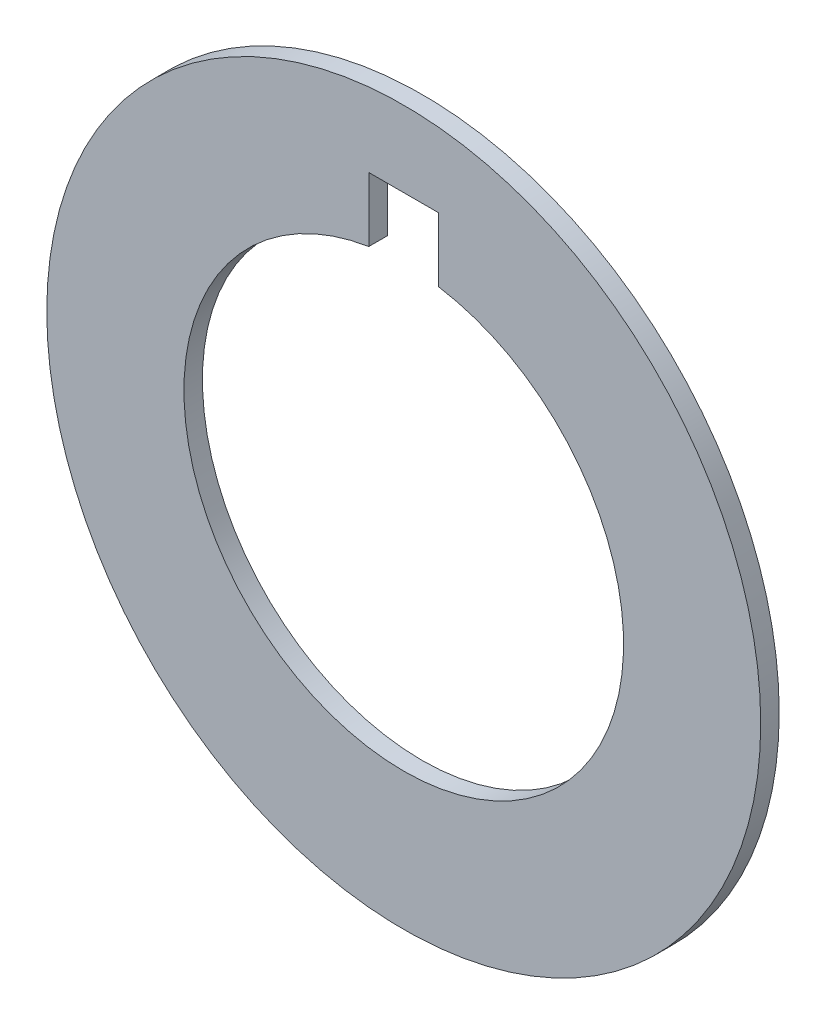
ISO-10303-21;
HEADER;
FILE_DESCRIPTION(('STEP AP214'),'2;1');
FILE_NAME('part.step','',(''),(''),'','','');
FILE_SCHEMA(('AUTOMOTIVE_DESIGN { 1 0 10303 214 1 1 1 1 }'));
ENDSEC;
DATA;
#1=APPLICATION_CONTEXT('core data for automotive mechanical design processes');
#2=APPLICATION_PROTOCOL_DEFINITION('international standard','automotive_design',2000,#1);
#3=PRODUCT_CONTEXT('',#1,'mechanical');
#4=PRODUCT('Part','Part','',(#3));
#5=PRODUCT_RELATED_PRODUCT_CATEGORY('part','',(#4));
#6=PRODUCT_DEFINITION_FORMATION('','',#4);
#7=PRODUCT_DEFINITION_CONTEXT('part definition',#1,'design');
#8=PRODUCT_DEFINITION('design','',#6,#7);
#9=PRODUCT_DEFINITION_SHAPE('','',#8);
#10=(LENGTH_UNIT() NAMED_UNIT(*) SI_UNIT(.MILLI.,.METRE.));
#11=(NAMED_UNIT(*) PLANE_ANGLE_UNIT() SI_UNIT($,.RADIAN.));
#12=(NAMED_UNIT(*) SI_UNIT($,.STERADIAN.) SOLID_ANGLE_UNIT());
#13=UNCERTAINTY_MEASURE_WITH_UNIT(LENGTH_MEASURE(1.E-05),#10,'distance_accuracy_value','');
#14=(GEOMETRIC_REPRESENTATION_CONTEXT(3) GLOBAL_UNCERTAINTY_ASSIGNED_CONTEXT((#13)) GLOBAL_UNIT_ASSIGNED_CONTEXT((#10,
#11,#12)) REPRESENTATION_CONTEXT('',''));
#15=CARTESIAN_POINT('',(0.,0.,0.));
#16=DIRECTION('',(0.,0.,1.));
#17=DIRECTION('',(1.,0.,0.));
#18=AXIS2_PLACEMENT_3D('',#15,#16,#17);
#19=CARTESIAN_POINT('',(0.,0.,0.9398));
#20=DIRECTION('',(0.,0.,1.));
#21=DIRECTION('',(1.,0.,0.));
#22=AXIS2_PLACEMENT_3D('',#19,#20,#21);
#23=PLANE('',#22);
#24=CARTESIAN_POINT('',(0.,0.,0.9398));
#25=DIRECTION('',(0.,0.,1.));
#26=DIRECTION('',(1.,0.,0.));
#27=AXIS2_PLACEMENT_3D('',#24,#25,#26);
#28=CIRCLE('',#27,11.176);
#29=CARTESIAN_POINT('',(1.778,11.0336617675185,0.9398));
#30=VERTEX_POINT('',#29);
#31=CARTESIAN_POINT('',(-1.778,11.0336617675185,0.9398));
#32=VERTEX_POINT('',#31);
#33=EDGE_CURVE('E44',#30,#32,#28,.F.);
#34=ORIENTED_EDGE('',*,*,#33,.T.);
#35=DIRECTION('',(0.,1.,0.));
#36=VECTOR('',#35,1.);
#37=CARTESIAN_POINT('',(-1.778,11.0336617675185,0.9398));
#38=LINE('',#37,#36);
#39=CARTESIAN_POINT('',(-1.778,14.2944088179873,0.9398));
#40=VERTEX_POINT('',#39);
#41=EDGE_CURVE('E90',#40,#32,#38,.F.);
#42=ORIENTED_EDGE('',*,*,#41,.F.);
#43=DIRECTION('',(1.,0.,0.));
#44=VECTOR('',#43,1.);
#45=CARTESIAN_POINT('',(-1.778,14.2944088179873,0.9398));
#46=LINE('',#45,#44);
#47=CARTESIAN_POINT('',(1.778,14.2944088179873,0.9398));
#48=VERTEX_POINT('',#47);
#49=EDGE_CURVE('E57',#48,#40,#46,.F.);
#50=ORIENTED_EDGE('',*,*,#49,.F.);
#51=DIRECTION('',(0.,1.,0.));
#52=VECTOR('',#51,1.);
#53=CARTESIAN_POINT('',(1.778,14.2944088179873,0.9398));
#54=LINE('',#53,#52);
#55=EDGE_CURVE('E78',#30,#48,#54,.T.);
#56=ORIENTED_EDGE('',*,*,#55,.F.);
#57=EDGE_LOOP('',(#34,#42,#50,#56));
#58=FACE_BOUND('',#57,.T.);
#59=CARTESIAN_POINT('',(0.,0.,0.9398));
#60=DIRECTION('',(0.,0.,1.));
#61=DIRECTION('',(1.,0.,0.));
#62=AXIS2_PLACEMENT_3D('',#59,#60,#61);
#63=CIRCLE('',#62,18.1483);
#64=CARTESIAN_POINT('',(18.1483,0.,0.9398));
#65=VERTEX_POINT('',#64);
#66=EDGE_CURVE('E19',#65,#65,#63,.F.);
#67=ORIENTED_EDGE('',*,*,#66,.F.);
#68=EDGE_LOOP('',(#67));
#69=FACE_BOUND('',#68,.T.);
#70=ADVANCED_FACE('F16',(#58,#69),#23,.T.);
#71=CARTESIAN_POINT('',(0.,0.,0.));
#72=DIRECTION('',(0.,0.,1.));
#73=DIRECTION('',(1.,0.,0.));
#74=AXIS2_PLACEMENT_3D('',#71,#72,#73);
#75=CYLINDRICAL_SURFACE('',#74,18.1483);
#76=ORIENTED_EDGE('',*,*,#66,.T.);
#77=EDGE_LOOP('',(#76));
#78=FACE_BOUND('',#77,.T.);
#79=CARTESIAN_POINT('',(0.,0.,0.));
#80=DIRECTION('',(0.,0.,1.));
#81=DIRECTION('',(1.,0.,0.));
#82=AXIS2_PLACEMENT_3D('',#79,#80,#81);
#83=CIRCLE('',#82,18.1483);
#84=CARTESIAN_POINT('',(18.1483,0.,0.));
#85=VERTEX_POINT('',#84);
#86=EDGE_CURVE('E73',#85,#85,#83,.F.);
#87=ORIENTED_EDGE('',*,*,#86,.F.);
#88=EDGE_LOOP('',(#87));
#89=FACE_BOUND('',#88,.T.);
#90=ADVANCED_FACE('F114',(#78,#89),#75,.T.);
#91=CARTESIAN_POINT('',(-1.778,14.2944088179873,0.));
#92=DIRECTION('',(0.,-1.,0.));
#93=DIRECTION('',(0.,0.,-1.));
#94=AXIS2_PLACEMENT_3D('',#91,#92,#93);
#95=PLANE('',#94);
#96=ORIENTED_EDGE('',*,*,#49,.T.);
#97=DIRECTION('',(0.,0.,-1.));
#98=VECTOR('',#97,1.);
#99=CARTESIAN_POINT('',(-1.778,14.2944088179873,0.));
#100=LINE('',#99,#98);
#101=CARTESIAN_POINT('',(-1.778,14.2944088179873,0.));
#102=VERTEX_POINT('',#101);
#103=EDGE_CURVE('E68',#102,#40,#100,.F.);
#104=ORIENTED_EDGE('',*,*,#103,.F.);
#105=DIRECTION('',(-1.,0.,0.));
#106=VECTOR('',#105,1.);
#107=CARTESIAN_POINT('',(0.,14.2944088179873,0.));
#108=LINE('',#107,#106);
#109=CARTESIAN_POINT('',(1.778,14.2944088179873,0.));
#110=VERTEX_POINT('',#109);
#111=EDGE_CURVE('E62',#110,#102,#108,.T.);
#112=ORIENTED_EDGE('',*,*,#111,.F.);
#113=DIRECTION('',(0.,0.,1.));
#114=VECTOR('',#113,1.);
#115=CARTESIAN_POINT('',(1.778,14.2944088179873,0.));
#116=LINE('',#115,#114);
#117=EDGE_CURVE('E65',#48,#110,#116,.F.);
#118=ORIENTED_EDGE('',*,*,#117,.F.);
#119=EDGE_LOOP('',(#96,#104,#112,#118));
#120=FACE_BOUND('',#119,.T.);
#121=ADVANCED_FACE('F64',(#120),#95,.T.);
#122=CARTESIAN_POINT('',(-1.778,11.0336617675185,0.));
#123=DIRECTION('',(1.,0.,0.));
#124=DIRECTION('',(0.,0.,-1.));
#125=AXIS2_PLACEMENT_3D('',#122,#123,#124);
#126=PLANE('',#125);
#127=ORIENTED_EDGE('',*,*,#41,.T.);
#128=DIRECTION('',(0.,0.,1.));
#129=VECTOR('',#128,1.);
#130=CARTESIAN_POINT('',(-1.778,11.0336617675185,0.4699));
#131=LINE('',#130,#129);
#132=CARTESIAN_POINT('',(-1.778,11.0336617675185,0.));
#133=VERTEX_POINT('',#132);
#134=EDGE_CURVE('E89',#32,#133,#131,.F.);
#135=ORIENTED_EDGE('',*,*,#134,.T.);
#136=DIRECTION('',(0.,1.,0.));
#137=VECTOR('',#136,1.);
#138=CARTESIAN_POINT('',(-1.778,0.,0.));
#139=LINE('',#138,#137);
#140=EDGE_CURVE('E72',#102,#133,#139,.F.);
#141=ORIENTED_EDGE('',*,*,#140,.F.);
#142=ORIENTED_EDGE('',*,*,#103,.T.);
#143=EDGE_LOOP('',(#127,#135,#141,#142));
#144=FACE_BOUND('',#143,.T.);
#145=ADVANCED_FACE('F132',(#144),#126,.T.);
#146=CARTESIAN_POINT('',(0.,0.,0.4699));
#147=DIRECTION('',(0.,0.,1.));
#148=DIRECTION('',(1.,0.,0.));
#149=AXIS2_PLACEMENT_3D('',#146,#147,#148);
#150=CYLINDRICAL_SURFACE('',#149,11.176);
#151=ORIENTED_EDGE('',*,*,#134,.F.);
#152=ORIENTED_EDGE('',*,*,#33,.F.);
#153=DIRECTION('',(0.,0.,1.));
#154=VECTOR('',#153,1.);
#155=CARTESIAN_POINT('',(1.778,11.0336617675185,0.));
#156=LINE('',#155,#154);
#157=CARTESIAN_POINT('',(1.778,11.0336617675185,0.));
#158=VERTEX_POINT('',#157);
#159=EDGE_CURVE('E34',#158,#30,#156,.T.);
#160=ORIENTED_EDGE('',*,*,#159,.F.);
#161=CARTESIAN_POINT('',(0.,0.,0.));
#162=DIRECTION('',(0.,0.,1.));
#163=DIRECTION('',(1.,0.,0.));
#164=AXIS2_PLACEMENT_3D('',#161,#162,#163);
#165=CIRCLE('',#164,11.176);
#166=EDGE_CURVE('E25',#133,#158,#165,.T.);
#167=ORIENTED_EDGE('',*,*,#166,.F.);
#168=EDGE_LOOP('',(#151,#152,#160,#167));
#169=FACE_BOUND('',#168,.T.);
#170=ADVANCED_FACE('F127',(#169),#150,.F.);
#171=CARTESIAN_POINT('',(1.778,14.2944088179873,0.));
#172=DIRECTION('',(-1.,0.,0.));
#173=DIRECTION('',(0.,0.,1.));
#174=AXIS2_PLACEMENT_3D('',#171,#172,#173);
#175=PLANE('',#174);
#176=ORIENTED_EDGE('',*,*,#55,.T.);
#177=ORIENTED_EDGE('',*,*,#117,.T.);
#178=DIRECTION('',(0.,1.,0.));
#179=VECTOR('',#178,1.);
#180=CARTESIAN_POINT('',(1.778,0.,0.));
#181=LINE('',#180,#179);
#182=EDGE_CURVE('E10',#158,#110,#181,.T.);
#183=ORIENTED_EDGE('',*,*,#182,.F.);
#184=ORIENTED_EDGE('',*,*,#159,.T.);
#185=EDGE_LOOP('',(#176,#177,#183,#184));
#186=FACE_BOUND('',#185,.T.);
#187=ADVANCED_FACE('F76',(#186),#175,.T.);
#188=CARTESIAN_POINT('',(0.,0.,0.));
#189=DIRECTION('',(0.,0.,-1.));
#190=DIRECTION('',(-1.,0.,0.));
#191=AXIS2_PLACEMENT_3D('',#188,#189,#190);
#192=PLANE('',#191);
#193=ORIENTED_EDGE('',*,*,#166,.T.);
#194=ORIENTED_EDGE('',*,*,#182,.T.);
#195=ORIENTED_EDGE('',*,*,#111,.T.);
#196=ORIENTED_EDGE('',*,*,#140,.T.);
#197=EDGE_LOOP('',(#193,#194,#195,#196));
#198=FACE_BOUND('',#197,.T.);
#199=ORIENTED_EDGE('',*,*,#86,.T.);
#200=EDGE_LOOP('',(#199));
#201=FACE_BOUND('',#200,.T.);
#202=ADVANCED_FACE('F80',(#198,#201),#192,.T.);
#203=CLOSED_SHELL('',(#70,#90,#121,#145,#170,#187,#202));
#204=MANIFOLD_SOLID_BREP('B1',#203);
#205=ADVANCED_BREP_SHAPE_REPRESENTATION('',(#18,#204),#14);
#206=SHAPE_DEFINITION_REPRESENTATION(#9,#205);
ENDSEC;
END-ISO-10303-21;
